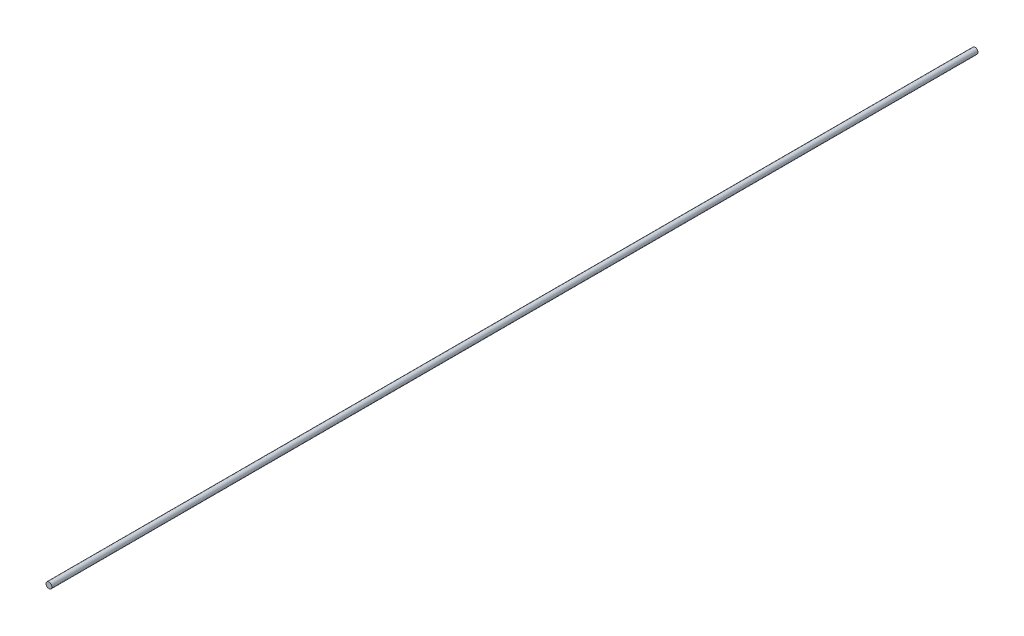
ISO-10303-21;
HEADER;
FILE_DESCRIPTION(('STEP AP214'),'2;1');
FILE_NAME('part.step','',(''),(''),'','','');
FILE_SCHEMA(('AUTOMOTIVE_DESIGN { 1 0 10303 214 1 1 1 1 }'));
ENDSEC;
DATA;
#1=APPLICATION_CONTEXT('core data for automotive mechanical design processes');
#2=APPLICATION_PROTOCOL_DEFINITION('international standard','automotive_design',2000,#1);
#3=PRODUCT_CONTEXT('',#1,'mechanical');
#4=PRODUCT('Part','Part','',(#3));
#5=PRODUCT_RELATED_PRODUCT_CATEGORY('part','',(#4));
#6=PRODUCT_DEFINITION_FORMATION('','',#4);
#7=PRODUCT_DEFINITION_CONTEXT('part definition',#1,'design');
#8=PRODUCT_DEFINITION('design','',#6,#7);
#9=PRODUCT_DEFINITION_SHAPE('','',#8);
#10=(LENGTH_UNIT() NAMED_UNIT(*) SI_UNIT(.MILLI.,.METRE.));
#11=(NAMED_UNIT(*) PLANE_ANGLE_UNIT() SI_UNIT($,.RADIAN.));
#12=(NAMED_UNIT(*) SI_UNIT($,.STERADIAN.) SOLID_ANGLE_UNIT());
#13=UNCERTAINTY_MEASURE_WITH_UNIT(LENGTH_MEASURE(1.E-05),#10,'distance_accuracy_value','');
#14=(GEOMETRIC_REPRESENTATION_CONTEXT(3) GLOBAL_UNCERTAINTY_ASSIGNED_CONTEXT((#13)) GLOBAL_UNIT_ASSIGNED_CONTEXT((#10,
#11,#12)) REPRESENTATION_CONTEXT('',''));
#15=CARTESIAN_POINT('',(0.,0.,0.));
#16=DIRECTION('',(0.,0.,1.));
#17=DIRECTION('',(1.,0.,0.));
#18=AXIS2_PLACEMENT_3D('',#15,#16,#17);
#19=CARTESIAN_POINT('',(0.,0.,126.290856352969));
#20=DIRECTION('',(0.,0.,-1.));
#21=DIRECTION('',(-1.,0.,0.));
#22=AXIS2_PLACEMENT_3D('',#19,#20,#21);
#23=CYLINDRICAL_SURFACE('',#22,0.4);
#24=CARTESIAN_POINT('',(0.,0.,126.290856352969));
#25=DIRECTION('',(0.,0.,1.));
#26=DIRECTION('',(1.,0.,0.));
#27=AXIS2_PLACEMENT_3D('',#24,#25,#26);
#28=CIRCLE('',#27,0.4);
#29=CARTESIAN_POINT('',(0.4,0.,126.290856352969));
#30=VERTEX_POINT('',#29);
#31=EDGE_CURVE('E10',#30,#30,#28,.T.);
#32=ORIENTED_EDGE('',*,*,#31,.F.);
#33=EDGE_LOOP('',(#32));
#34=FACE_BOUND('',#33,.T.);
#35=CARTESIAN_POINT('',(0.,0.,0.));
#36=DIRECTION('',(0.,0.,1.));
#37=DIRECTION('',(1.,0.,0.));
#38=AXIS2_PLACEMENT_3D('',#35,#36,#37);
#39=CIRCLE('',#38,0.4);
#40=CARTESIAN_POINT('',(0.4,0.,0.));
#41=VERTEX_POINT('',#40);
#42=EDGE_CURVE('E40',#41,#41,#39,.T.);
#43=ORIENTED_EDGE('',*,*,#42,.T.);
#44=EDGE_LOOP('',(#43));
#45=FACE_BOUND('',#44,.T.);
#46=ADVANCED_FACE('F37',(#34,#45),#23,.T.);
#47=CARTESIAN_POINT('',(0.,0.,126.290856352969));
#48=DIRECTION('',(0.,0.,1.));
#49=DIRECTION('',(1.,0.,0.));
#50=AXIS2_PLACEMENT_3D('',#47,#48,#49);
#51=PLANE('',#50);
#52=ORIENTED_EDGE('',*,*,#31,.T.);
#53=EDGE_LOOP('',(#52));
#54=FACE_BOUND('',#53,.T.);
#55=ADVANCED_FACE('F52',(#54),#51,.T.);
#56=CARTESIAN_POINT('',(0.,0.,0.));
#57=DIRECTION('',(0.,0.,1.));
#58=DIRECTION('',(1.,0.,0.));
#59=AXIS2_PLACEMENT_3D('',#56,#57,#58);
#60=PLANE('',#59);
#61=ORIENTED_EDGE('',*,*,#42,.F.);
#62=EDGE_LOOP('',(#61));
#63=FACE_BOUND('',#62,.T.);
#64=ADVANCED_FACE('F50',(#63),#60,.F.);
#65=CLOSED_SHELL('',(#46,#55,#64));
#66=MANIFOLD_SOLID_BREP('B2',#65);
#67=ADVANCED_BREP_SHAPE_REPRESENTATION('',(#18,#66),#14);
#68=SHAPE_DEFINITION_REPRESENTATION(#9,#67);
ENDSEC;
END-ISO-10303-21;
